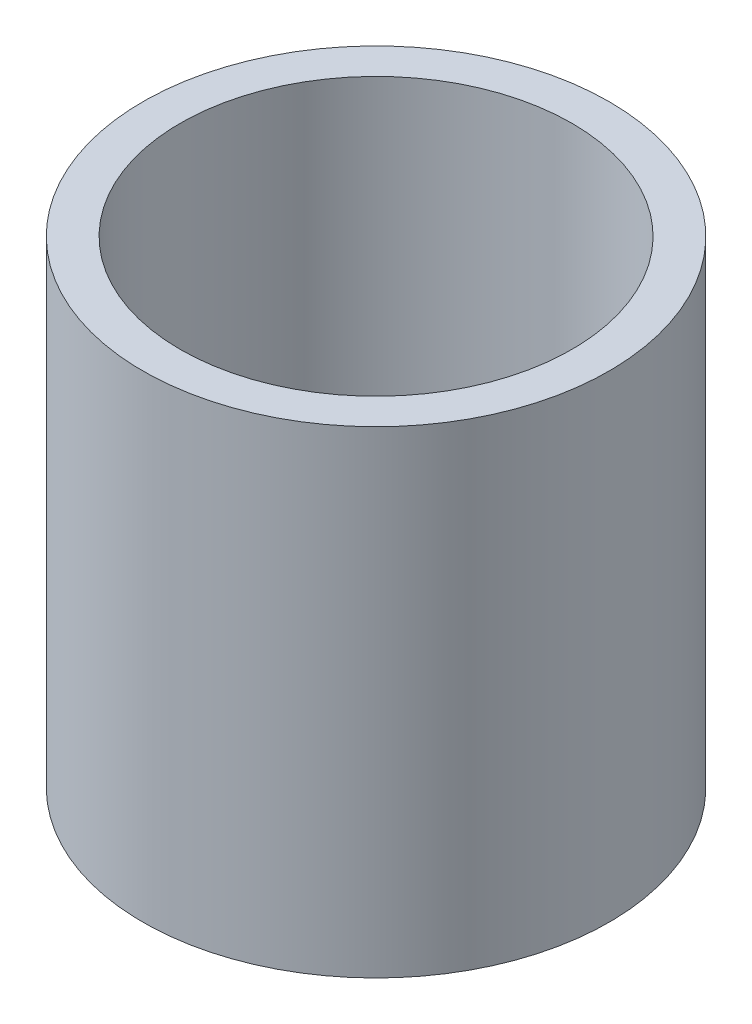
ISO-10303-21;
HEADER;
FILE_DESCRIPTION(('STEP AP214'),'2;1');
FILE_NAME('part.step','',(''),(''),'','','');
FILE_SCHEMA(('AUTOMOTIVE_DESIGN { 1 0 10303 214 1 1 1 1 }'));
ENDSEC;
DATA;
#1=APPLICATION_CONTEXT('core data for automotive mechanical design processes');
#2=APPLICATION_PROTOCOL_DEFINITION('international standard','automotive_design',2000,#1);
#3=PRODUCT_CONTEXT('',#1,'mechanical');
#4=PRODUCT('Part','Part','',(#3));
#5=PRODUCT_RELATED_PRODUCT_CATEGORY('part','',(#4));
#6=PRODUCT_DEFINITION_FORMATION('','',#4);
#7=PRODUCT_DEFINITION_CONTEXT('part definition',#1,'design');
#8=PRODUCT_DEFINITION('design','',#6,#7);
#9=PRODUCT_DEFINITION_SHAPE('','',#8);
#10=(LENGTH_UNIT() NAMED_UNIT(*) SI_UNIT(.MILLI.,.METRE.));
#11=(NAMED_UNIT(*) PLANE_ANGLE_UNIT() SI_UNIT($,.RADIAN.));
#12=(NAMED_UNIT(*) SI_UNIT($,.STERADIAN.) SOLID_ANGLE_UNIT());
#13=UNCERTAINTY_MEASURE_WITH_UNIT(LENGTH_MEASURE(1.E-05),#10,'distance_accuracy_value','');
#14=(GEOMETRIC_REPRESENTATION_CONTEXT(3) GLOBAL_UNCERTAINTY_ASSIGNED_CONTEXT((#13)) GLOBAL_UNIT_ASSIGNED_CONTEXT((#10,
#11,#12)) REPRESENTATION_CONTEXT('',''));
#15=CARTESIAN_POINT('',(0.,0.,0.));
#16=DIRECTION('',(0.,0.,1.));
#17=DIRECTION('',(1.,0.,0.));
#18=AXIS2_PLACEMENT_3D('',#15,#16,#17);
#19=CARTESIAN_POINT('',(0.,6.5,0.));
#20=DIRECTION('',(0.,1.,0.));
#21=DIRECTION('',(0.,0.,1.));
#22=AXIS2_PLACEMENT_3D('',#19,#20,#21);
#23=PLANE('',#22);
#24=CARTESIAN_POINT('',(0.,6.5,0.));
#25=DIRECTION('',(0.,1.,0.));
#26=DIRECTION('',(0.,0.,1.));
#27=AXIS2_PLACEMENT_3D('',#24,#25,#26);
#28=CIRCLE('',#27,3.175);
#29=CARTESIAN_POINT('',(0.,6.5,-3.175));
#30=VERTEX_POINT('',#29);
#31=EDGE_CURVE('E10',#30,#30,#28,.T.);
#32=ORIENTED_EDGE('',*,*,#31,.T.);
#33=EDGE_LOOP('',(#32));
#34=FACE_BOUND('',#33,.T.);
#35=CARTESIAN_POINT('',(0.,6.5,0.));
#36=DIRECTION('',(0.,1.,0.));
#37=DIRECTION('',(0.,0.,1.));
#38=AXIS2_PLACEMENT_3D('',#35,#36,#37);
#39=CIRCLE('',#38,2.667);
#40=CARTESIAN_POINT('',(0.,6.5,-2.667));
#41=VERTEX_POINT('',#40);
#42=EDGE_CURVE('E43',#41,#41,#39,.T.);
#43=ORIENTED_EDGE('',*,*,#42,.F.);
#44=EDGE_LOOP('',(#43));
#45=FACE_BOUND('',#44,.T.);
#46=ADVANCED_FACE('F32',(#34,#45),#23,.T.);
#47=CARTESIAN_POINT('',(0.,0.,0.));
#48=DIRECTION('',(0.,1.,0.));
#49=DIRECTION('',(0.,0.,1.));
#50=AXIS2_PLACEMENT_3D('',#47,#48,#49);
#51=PLANE('',#50);
#52=CARTESIAN_POINT('',(0.,0.,0.));
#53=DIRECTION('',(0.,1.,0.));
#54=DIRECTION('',(0.,0.,1.));
#55=AXIS2_PLACEMENT_3D('',#52,#53,#54);
#56=CIRCLE('',#55,3.175);
#57=CARTESIAN_POINT('',(0.,0.,-3.175));
#58=VERTEX_POINT('',#57);
#59=EDGE_CURVE('E36',#58,#58,#56,.T.);
#60=ORIENTED_EDGE('',*,*,#59,.F.);
#61=EDGE_LOOP('',(#60));
#62=FACE_BOUND('',#61,.T.);
#63=CARTESIAN_POINT('',(0.,0.,0.));
#64=DIRECTION('',(0.,1.,0.));
#65=DIRECTION('',(0.,0.,1.));
#66=AXIS2_PLACEMENT_3D('',#63,#64,#65);
#67=CIRCLE('',#66,2.667);
#68=CARTESIAN_POINT('',(0.,0.,-2.667));
#69=VERTEX_POINT('',#68);
#70=EDGE_CURVE('E45',#69,#69,#67,.T.);
#71=ORIENTED_EDGE('',*,*,#70,.T.);
#72=EDGE_LOOP('',(#71));
#73=FACE_BOUND('',#72,.T.);
#74=ADVANCED_FACE('F55',(#62,#73),#51,.F.);
#75=CARTESIAN_POINT('',(0.,6.5,0.));
#76=DIRECTION('',(0.,-1.,0.));
#77=DIRECTION('',(0.,0.,-1.));
#78=AXIS2_PLACEMENT_3D('',#75,#76,#77);
#79=CYLINDRICAL_SURFACE('',#78,3.175);
#80=CARTESIAN_POINT('',(0.,6.5,-3.175));
#81=CARTESIAN_POINT('',(0.,6.43229166666667,-3.175));
#82=CARTESIAN_POINT('',(0.,6.36458333333333,-3.175));
#83=CARTESIAN_POINT('',(0.,6.22916666666667,-3.175));
#84=CARTESIAN_POINT('',(0.,6.16145833333333,-3.175));
#85=CARTESIAN_POINT('',(0.,6.02604166666667,-3.175));
#86=CARTESIAN_POINT('',(0.,5.95833333333333,-3.175));
#87=CARTESIAN_POINT('',(0.,5.82291666666667,-3.175));
#88=CARTESIAN_POINT('',(0.,5.75520833333333,-3.175));
#89=CARTESIAN_POINT('',(0.,5.61979166666667,-3.175));
#90=CARTESIAN_POINT('',(0.,5.55208333333333,-3.175));
#91=CARTESIAN_POINT('',(0.,5.41666666666667,-3.175));
#92=CARTESIAN_POINT('',(0.,5.34895833333333,-3.175));
#93=CARTESIAN_POINT('',(0.,5.21354166666667,-3.175));
#94=CARTESIAN_POINT('',(0.,5.14583333333333,-3.175));
#95=CARTESIAN_POINT('',(0.,5.01041666666667,-3.175));
#96=CARTESIAN_POINT('',(0.,4.94270833333333,-3.175));
#97=CARTESIAN_POINT('',(0.,4.80729166666667,-3.175));
#98=CARTESIAN_POINT('',(0.,4.73958333333333,-3.175));
#99=CARTESIAN_POINT('',(0.,4.60416666666667,-3.175));
#100=CARTESIAN_POINT('',(0.,4.53645833333333,-3.175));
#101=CARTESIAN_POINT('',(0.,4.40104166666667,-3.175));
#102=CARTESIAN_POINT('',(0.,4.33333333333333,-3.175));
#103=CARTESIAN_POINT('',(0.,4.19791666666667,-3.175));
#104=CARTESIAN_POINT('',(0.,4.13020833333333,-3.175));
#105=CARTESIAN_POINT('',(0.,3.99479166666667,-3.175));
#106=CARTESIAN_POINT('',(0.,3.92708333333333,-3.175));
#107=CARTESIAN_POINT('',(0.,3.79166666666667,-3.175));
#108=CARTESIAN_POINT('',(0.,3.72395833333333,-3.175));
#109=CARTESIAN_POINT('',(0.,3.58854166666667,-3.175));
#110=CARTESIAN_POINT('',(0.,3.52083333333333,-3.175));
#111=CARTESIAN_POINT('',(0.,3.38541666666667,-3.175));
#112=CARTESIAN_POINT('',(0.,3.31770833333333,-3.175));
#113=CARTESIAN_POINT('',(0.,3.18229166666667,-3.175));
#114=CARTESIAN_POINT('',(0.,3.11458333333333,-3.175));
#115=CARTESIAN_POINT('',(0.,2.97916666666667,-3.175));
#116=CARTESIAN_POINT('',(0.,2.91145833333333,-3.175));
#117=CARTESIAN_POINT('',(0.,2.77604166666667,-3.175));
#118=CARTESIAN_POINT('',(0.,2.70833333333333,-3.175));
#119=CARTESIAN_POINT('',(0.,2.57291666666667,-3.175));
#120=CARTESIAN_POINT('',(0.,2.50520833333333,-3.175));
#121=CARTESIAN_POINT('',(0.,2.36979166666667,-3.175));
#122=CARTESIAN_POINT('',(0.,2.30208333333333,-3.175));
#123=CARTESIAN_POINT('',(0.,2.16666666666667,-3.175));
#124=CARTESIAN_POINT('',(0.,2.09895833333333,-3.175));
#125=CARTESIAN_POINT('',(0.,1.96354166666667,-3.175));
#126=CARTESIAN_POINT('',(0.,1.89583333333333,-3.175));
#127=CARTESIAN_POINT('',(0.,1.76041666666667,-3.175));
#128=CARTESIAN_POINT('',(0.,1.69270833333333,-3.175));
#129=CARTESIAN_POINT('',(0.,1.55729166666667,-3.175));
#130=CARTESIAN_POINT('',(0.,1.48958333333333,-3.175));
#131=CARTESIAN_POINT('',(0.,1.35416666666667,-3.175));
#132=CARTESIAN_POINT('',(0.,1.28645833333333,-3.175));
#133=CARTESIAN_POINT('',(0.,1.15104166666667,-3.175));
#134=CARTESIAN_POINT('',(0.,1.08333333333333,-3.175));
#135=CARTESIAN_POINT('',(0.,0.947916666666667,-3.175));
#136=CARTESIAN_POINT('',(0.,0.880208333333333,-3.175));
#137=CARTESIAN_POINT('',(0.,0.744791666666667,-3.175));
#138=CARTESIAN_POINT('',(0.,0.677083333333333,-3.175));
#139=CARTESIAN_POINT('',(0.,0.541666666666667,-3.175));
#140=CARTESIAN_POINT('',(0.,0.473958333333333,-3.175));
#141=CARTESIAN_POINT('',(0.,0.338541666666667,-3.175));
#142=CARTESIAN_POINT('',(0.,0.270833333333334,-3.175));
#143=CARTESIAN_POINT('',(0.,0.135416666666667,-3.175));
#144=CARTESIAN_POINT('',(0.,0.0677083333333334,-3.175));
#145=CARTESIAN_POINT('',(0.,0.,-3.175));
#146=B_SPLINE_CURVE_WITH_KNOTS('',3,(#80,#81,#82,#83,#84,#85,#86,#87,#88,#89,#90,#91,#92,#93,
#94,#95,#96,#97,#98,#99,#100,#101,#102,#103,#104,#105,#106,#107,#108,#109,#110,#111,#112,#113,
#114,#115,#116,#117,#118,#119,#120,#121,#122,#123,#124,#125,#126,#127,#128,#129,#130,#131,#132,
#133,#134,#135,#136,#137,#138,#139,#140,#141,#142,#143,#144,#145),.UNSPECIFIED.,.F.,.F.,(4,2,2,
2,2,2,2,2,2,2,2,2,2,2,2,2,2,2,2,2,2,2,2,2,2,2,2,2,2,2,2,2,4),(0.,0.203125,0.40625,
0.609375000000001,0.812500000000001,1.015625,1.21875,1.421875,1.625,1.828125,2.03125,2.234375,
2.4375,2.640625,2.84375,3.046875,3.25,3.453125,3.65625,3.859375,4.0625,4.265625,4.46875,
4.671875,4.875,5.078125,5.28125,5.484375,5.6875,5.890625,6.09375,6.296875,6.5),.UNSPECIFIED.);
#147=EDGE_CURVE('BSEAM34',#30,#58,#146,.T.);
#148=ORIENTED_EDGE('',*,*,#31,.F.);
#149=ORIENTED_EDGE('',*,*,#59,.T.);
#150=ORIENTED_EDGE('',*,*,#147,.T.);
#151=ORIENTED_EDGE('',*,*,#147,.F.);
#152=EDGE_LOOP('',(#148,#150,#149,#151));
#153=FACE_BOUND('',#152,.T.);
#154=ADVANCED_FACE('F34',(#153),#79,.T.);
#155=CARTESIAN_POINT('',(0.,6.5,0.));
#156=DIRECTION('',(0.,-1.,0.));
#157=DIRECTION('',(0.,0.,-1.));
#158=AXIS2_PLACEMENT_3D('',#155,#156,#157);
#159=CYLINDRICAL_SURFACE('',#158,2.667);
#160=CARTESIAN_POINT('',(0.,6.5,-2.667));
#161=CARTESIAN_POINT('',(0.,6.43229166666667,-2.667));
#162=CARTESIAN_POINT('',(0.,6.36458333333333,-2.667));
#163=CARTESIAN_POINT('',(0.,6.22916666666667,-2.667));
#164=CARTESIAN_POINT('',(0.,6.16145833333333,-2.667));
#165=CARTESIAN_POINT('',(0.,6.02604166666667,-2.667));
#166=CARTESIAN_POINT('',(0.,5.95833333333333,-2.667));
#167=CARTESIAN_POINT('',(0.,5.82291666666667,-2.667));
#168=CARTESIAN_POINT('',(0.,5.75520833333333,-2.667));
#169=CARTESIAN_POINT('',(0.,5.61979166666667,-2.667));
#170=CARTESIAN_POINT('',(0.,5.55208333333333,-2.667));
#171=CARTESIAN_POINT('',(0.,5.41666666666667,-2.667));
#172=CARTESIAN_POINT('',(0.,5.34895833333333,-2.667));
#173=CARTESIAN_POINT('',(0.,5.21354166666667,-2.667));
#174=CARTESIAN_POINT('',(0.,5.14583333333333,-2.667));
#175=CARTESIAN_POINT('',(0.,5.01041666666667,-2.667));
#176=CARTESIAN_POINT('',(0.,4.94270833333333,-2.667));
#177=CARTESIAN_POINT('',(0.,4.80729166666667,-2.667));
#178=CARTESIAN_POINT('',(0.,4.73958333333333,-2.667));
#179=CARTESIAN_POINT('',(0.,4.60416666666667,-2.667));
#180=CARTESIAN_POINT('',(0.,4.53645833333333,-2.667));
#181=CARTESIAN_POINT('',(0.,4.40104166666667,-2.667));
#182=CARTESIAN_POINT('',(0.,4.33333333333333,-2.667));
#183=CARTESIAN_POINT('',(0.,4.19791666666667,-2.667));
#184=CARTESIAN_POINT('',(0.,4.13020833333333,-2.667));
#185=CARTESIAN_POINT('',(0.,3.99479166666667,-2.667));
#186=CARTESIAN_POINT('',(0.,3.92708333333333,-2.667));
#187=CARTESIAN_POINT('',(0.,3.79166666666667,-2.667));
#188=CARTESIAN_POINT('',(0.,3.72395833333333,-2.667));
#189=CARTESIAN_POINT('',(0.,3.58854166666667,-2.667));
#190=CARTESIAN_POINT('',(0.,3.52083333333333,-2.667));
#191=CARTESIAN_POINT('',(0.,3.38541666666667,-2.667));
#192=CARTESIAN_POINT('',(0.,3.31770833333333,-2.667));
#193=CARTESIAN_POINT('',(0.,3.18229166666667,-2.667));
#194=CARTESIAN_POINT('',(0.,3.11458333333333,-2.667));
#195=CARTESIAN_POINT('',(0.,2.97916666666667,-2.667));
#196=CARTESIAN_POINT('',(0.,2.91145833333333,-2.667));
#197=CARTESIAN_POINT('',(0.,2.77604166666667,-2.667));
#198=CARTESIAN_POINT('',(0.,2.70833333333333,-2.667));
#199=CARTESIAN_POINT('',(0.,2.57291666666667,-2.667));
#200=CARTESIAN_POINT('',(0.,2.50520833333333,-2.667));
#201=CARTESIAN_POINT('',(0.,2.36979166666667,-2.667));
#202=CARTESIAN_POINT('',(0.,2.30208333333333,-2.667));
#203=CARTESIAN_POINT('',(0.,2.16666666666667,-2.667));
#204=CARTESIAN_POINT('',(0.,2.09895833333333,-2.667));
#205=CARTESIAN_POINT('',(0.,1.96354166666667,-2.667));
#206=CARTESIAN_POINT('',(0.,1.89583333333333,-2.667));
#207=CARTESIAN_POINT('',(0.,1.76041666666667,-2.667));
#208=CARTESIAN_POINT('',(0.,1.69270833333333,-2.667));
#209=CARTESIAN_POINT('',(0.,1.55729166666667,-2.667));
#210=CARTESIAN_POINT('',(0.,1.48958333333333,-2.667));
#211=CARTESIAN_POINT('',(0.,1.35416666666667,-2.667));
#212=CARTESIAN_POINT('',(0.,1.28645833333333,-2.667));
#213=CARTESIAN_POINT('',(0.,1.15104166666667,-2.667));
#214=CARTESIAN_POINT('',(0.,1.08333333333333,-2.667));
#215=CARTESIAN_POINT('',(0.,0.947916666666667,-2.667));
#216=CARTESIAN_POINT('',(0.,0.880208333333333,-2.667));
#217=CARTESIAN_POINT('',(0.,0.744791666666667,-2.667));
#218=CARTESIAN_POINT('',(0.,0.677083333333333,-2.667));
#219=CARTESIAN_POINT('',(0.,0.541666666666667,-2.667));
#220=CARTESIAN_POINT('',(0.,0.473958333333333,-2.667));
#221=CARTESIAN_POINT('',(0.,0.338541666666667,-2.667));
#222=CARTESIAN_POINT('',(0.,0.270833333333334,-2.667));
#223=CARTESIAN_POINT('',(0.,0.135416666666667,-2.667));
#224=CARTESIAN_POINT('',(0.,0.0677083333333334,-2.667));
#225=CARTESIAN_POINT('',(0.,0.,-2.667));
#226=B_SPLINE_CURVE_WITH_KNOTS('',3,(#160,#161,#162,#163,#164,#165,#166,#167,#168,#169,#170,
#171,#172,#173,#174,#175,#176,#177,#178,#179,#180,#181,#182,#183,#184,#185,#186,#187,#188,#189,
#190,#191,#192,#193,#194,#195,#196,#197,#198,#199,#200,#201,#202,#203,#204,#205,#206,#207,#208,
#209,#210,#211,#212,#213,#214,#215,#216,#217,#218,#219,#220,#221,#222,#223,#224,#225),
.UNSPECIFIED.,.F.,.F.,(4,2,2,2,2,2,2,2,2,2,2,2,2,2,2,2,2,2,2,2,2,2,2,2,2,2,2,2,2,2,2,2,4),(0.,
0.203124999999999,0.40625,0.609375,0.812499999999999,1.015625,1.21875,1.421875,1.625,1.828125,
2.03125,2.234375,2.4375,2.640625,2.84375,3.046875,3.25,3.453125,3.65625,3.859375,4.0625,
4.265625,4.46875,4.671875,4.875,5.078125,5.28125,5.484375,5.6875,5.890625,6.09375,6.296875,6.5),.UNSPECIFIED.);
#227=EDGE_CURVE('BSEAM51',#41,#69,#226,.T.);
#228=ORIENTED_EDGE('',*,*,#42,.T.);
#229=ORIENTED_EDGE('',*,*,#70,.F.);
#230=ORIENTED_EDGE('',*,*,#227,.T.);
#231=ORIENTED_EDGE('',*,*,#227,.F.);
#232=EDGE_LOOP('',(#228,#230,#229,#231));
#233=FACE_BOUND('',#232,.T.);
#234=ADVANCED_FACE('F51',(#233),#159,.F.);
#235=CLOSED_SHELL('',(#46,#74,#154,#234));
#236=MANIFOLD_SOLID_BREP('B2',#235);
#237=ADVANCED_BREP_SHAPE_REPRESENTATION('',(#18,#236),#14);
#238=SHAPE_DEFINITION_REPRESENTATION(#9,#237);
ENDSEC;
END-ISO-10303-21;
